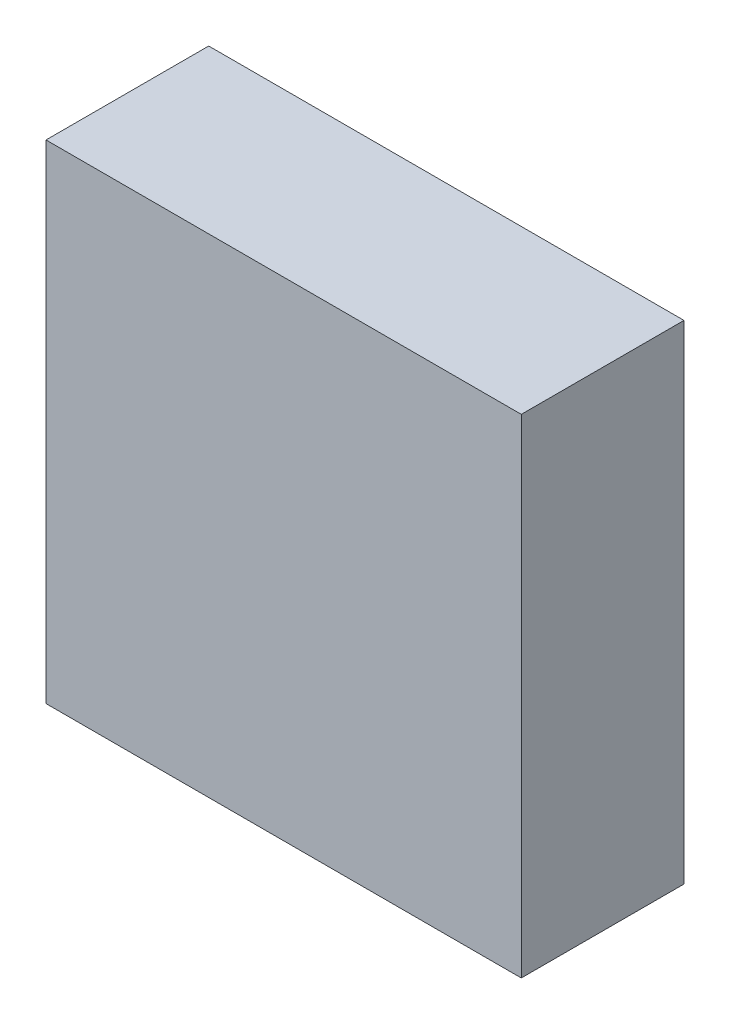
ISO-10303-21;
HEADER;
FILE_DESCRIPTION(('STEP AP214'),'2;1');
FILE_NAME('part.step','',(''),(''),'','','');
FILE_SCHEMA(('AUTOMOTIVE_DESIGN { 1 0 10303 214 1 1 1 1 }'));
ENDSEC;
DATA;
#1=APPLICATION_CONTEXT('core data for automotive mechanical design processes');
#2=APPLICATION_PROTOCOL_DEFINITION('international standard','automotive_design',2000,#1);
#3=PRODUCT_CONTEXT('',#1,'mechanical');
#4=PRODUCT('Part','Part','',(#3));
#5=PRODUCT_RELATED_PRODUCT_CATEGORY('part','',(#4));
#6=PRODUCT_DEFINITION_FORMATION('','',#4);
#7=PRODUCT_DEFINITION_CONTEXT('part definition',#1,'design');
#8=PRODUCT_DEFINITION('design','',#6,#7);
#9=PRODUCT_DEFINITION_SHAPE('','',#8);
#10=(LENGTH_UNIT() NAMED_UNIT(*) SI_UNIT(.MILLI.,.METRE.));
#11=(NAMED_UNIT(*) PLANE_ANGLE_UNIT() SI_UNIT($,.RADIAN.));
#12=(NAMED_UNIT(*) SI_UNIT($,.STERADIAN.) SOLID_ANGLE_UNIT());
#13=UNCERTAINTY_MEASURE_WITH_UNIT(LENGTH_MEASURE(1.E-05),#10,'distance_accuracy_value','');
#14=(GEOMETRIC_REPRESENTATION_CONTEXT(3) GLOBAL_UNCERTAINTY_ASSIGNED_CONTEXT((#13)) GLOBAL_UNIT_ASSIGNED_CONTEXT((#10,
#11,#12)) REPRESENTATION_CONTEXT('',''));
#15=CARTESIAN_POINT('',(0.,0.,0.));
#16=DIRECTION('',(0.,0.,1.));
#17=DIRECTION('',(1.,0.,0.));
#18=AXIS2_PLACEMENT_3D('',#15,#16,#17);
#19=CARTESIAN_POINT('',(-1.4224,-1.5,1.));
#20=DIRECTION('',(1.,0.,0.));
#21=DIRECTION('',(0.,0.,-1.));
#22=AXIS2_PLACEMENT_3D('',#19,#20,#21);
#23=PLANE('',#22);
#24=DIRECTION('',(0.,-1.,0.));
#25=VECTOR('',#24,1.);
#26=CARTESIAN_POINT('',(-1.4224,-1.5,0.));
#27=LINE('',#26,#25);
#28=CARTESIAN_POINT('',(-1.4224,1.5,0.));
#29=VERTEX_POINT('',#28);
#30=CARTESIAN_POINT('',(-1.4224,-1.5,0.));
#31=VERTEX_POINT('',#30);
#32=EDGE_CURVE('E95',#29,#31,#27,.T.);
#33=ORIENTED_EDGE('',*,*,#32,.T.);
#34=DIRECTION('',(0.,0.,-1.));
#35=VECTOR('',#34,1.);
#36=CARTESIAN_POINT('',(-1.4224,-1.5,1.));
#37=LINE('',#36,#35);
#38=CARTESIAN_POINT('',(-1.4224,-1.5,1.));
#39=VERTEX_POINT('',#38);
#40=EDGE_CURVE('E11',#39,#31,#37,.T.);
#41=ORIENTED_EDGE('',*,*,#40,.F.);
#42=DIRECTION('',(0.,-1.,0.));
#43=VECTOR('',#42,1.);
#44=CARTESIAN_POINT('',(-1.4224,-1.5,1.));
#45=LINE('',#44,#43);
#46=CARTESIAN_POINT('',(-1.4224,1.5,1.));
#47=VERTEX_POINT('',#46);
#48=EDGE_CURVE('E83',#47,#39,#45,.T.);
#49=ORIENTED_EDGE('',*,*,#48,.F.);
#50=DIRECTION('',(0.,0.,-1.));
#51=VECTOR('',#50,1.);
#52=CARTESIAN_POINT('',(-1.4224,1.5,1.));
#53=LINE('',#52,#51);
#54=EDGE_CURVE('E91',#47,#29,#53,.T.);
#55=ORIENTED_EDGE('',*,*,#54,.T.);
#56=EDGE_LOOP('',(#33,#41,#49,#55));
#57=FACE_BOUND('',#56,.T.);
#58=ADVANCED_FACE('F32',(#57),#23,.F.);
#59=CARTESIAN_POINT('',(1.4986,-1.5,1.));
#60=DIRECTION('',(0.,1.,0.));
#61=DIRECTION('',(0.,0.,1.));
#62=AXIS2_PLACEMENT_3D('',#59,#60,#61);
#63=PLANE('',#62);
#64=DIRECTION('',(1.,0.,0.));
#65=VECTOR('',#64,1.);
#66=CARTESIAN_POINT('',(1.4986,-1.5,0.));
#67=LINE('',#66,#65);
#68=CARTESIAN_POINT('',(1.4986,-1.5,0.));
#69=VERTEX_POINT('',#68);
#70=EDGE_CURVE('E87',#31,#69,#67,.T.);
#71=ORIENTED_EDGE('',*,*,#70,.T.);
#72=DIRECTION('',(0.,0.,-1.));
#73=VECTOR('',#72,1.);
#74=CARTESIAN_POINT('',(1.4986,-1.5,1.));
#75=LINE('',#74,#73);
#76=CARTESIAN_POINT('',(1.4986,-1.5,1.));
#77=VERTEX_POINT('',#76);
#78=EDGE_CURVE('E40',#77,#69,#75,.T.);
#79=ORIENTED_EDGE('',*,*,#78,.F.);
#80=DIRECTION('',(1.,0.,0.));
#81=VECTOR('',#80,1.);
#82=CARTESIAN_POINT('',(1.4986,-1.5,1.));
#83=LINE('',#82,#81);
#84=EDGE_CURVE('E78',#39,#77,#83,.T.);
#85=ORIENTED_EDGE('',*,*,#84,.F.);
#86=ORIENTED_EDGE('',*,*,#40,.T.);
#87=EDGE_LOOP('',(#71,#79,#85,#86));
#88=FACE_BOUND('',#87,.T.);
#89=ADVANCED_FACE('F86',(#88),#63,.F.);
#90=CARTESIAN_POINT('',(1.4986,1.5,1.));
#91=DIRECTION('',(-1.,0.,0.));
#92=DIRECTION('',(0.,0.,1.));
#93=AXIS2_PLACEMENT_3D('',#90,#91,#92);
#94=PLANE('',#93);
#95=DIRECTION('',(0.,1.,0.));
#96=VECTOR('',#95,1.);
#97=CARTESIAN_POINT('',(1.4986,1.5,0.));
#98=LINE('',#97,#96);
#99=CARTESIAN_POINT('',(1.4986,1.5,0.));
#100=VERTEX_POINT('',#99);
#101=EDGE_CURVE('E65',#69,#100,#98,.T.);
#102=ORIENTED_EDGE('',*,*,#101,.T.);
#103=DIRECTION('',(0.,0.,-1.));
#104=VECTOR('',#103,1.);
#105=CARTESIAN_POINT('',(1.4986,1.5,1.));
#106=LINE('',#105,#104);
#107=CARTESIAN_POINT('',(1.4986,1.5,1.));
#108=VERTEX_POINT('',#107);
#109=EDGE_CURVE('E88',#108,#100,#106,.T.);
#110=ORIENTED_EDGE('',*,*,#109,.F.);
#111=DIRECTION('',(0.,1.,0.));
#112=VECTOR('',#111,1.);
#113=CARTESIAN_POINT('',(1.4986,1.5,1.));
#114=LINE('',#113,#112);
#115=EDGE_CURVE('E81',#77,#108,#114,.T.);
#116=ORIENTED_EDGE('',*,*,#115,.F.);
#117=ORIENTED_EDGE('',*,*,#78,.T.);
#118=EDGE_LOOP('',(#102,#110,#116,#117));
#119=FACE_BOUND('',#118,.T.);
#120=ADVANCED_FACE('F89',(#119),#94,.F.);
#121=CARTESIAN_POINT('',(-1.4224,1.5,1.));
#122=DIRECTION('',(0.,-1.,0.));
#123=DIRECTION('',(0.,0.,-1.));
#124=AXIS2_PLACEMENT_3D('',#121,#122,#123);
#125=PLANE('',#124);
#126=DIRECTION('',(-1.,0.,0.));
#127=VECTOR('',#126,1.);
#128=CARTESIAN_POINT('',(-1.4224,1.5,0.));
#129=LINE('',#128,#127);
#130=EDGE_CURVE('E71',#100,#29,#129,.T.);
#131=ORIENTED_EDGE('',*,*,#130,.T.);
#132=ORIENTED_EDGE('',*,*,#54,.F.);
#133=DIRECTION('',(-1.,0.,0.));
#134=VECTOR('',#133,1.);
#135=CARTESIAN_POINT('',(-1.4224,1.5,1.));
#136=LINE('',#135,#134);
#137=EDGE_CURVE('E48',#108,#47,#136,.T.);
#138=ORIENTED_EDGE('',*,*,#137,.F.);
#139=ORIENTED_EDGE('',*,*,#109,.T.);
#140=EDGE_LOOP('',(#131,#132,#138,#139));
#141=FACE_BOUND('',#140,.T.);
#142=ADVANCED_FACE('F102',(#141),#125,.F.);
#143=CARTESIAN_POINT('',(0.,0.,1.));
#144=DIRECTION('',(0.,0.,-1.));
#145=DIRECTION('',(-1.,0.,0.));
#146=AXIS2_PLACEMENT_3D('',#143,#144,#145);
#147=PLANE('',#146);
#148=ORIENTED_EDGE('',*,*,#48,.T.);
#149=ORIENTED_EDGE('',*,*,#84,.T.);
#150=ORIENTED_EDGE('',*,*,#115,.T.);
#151=ORIENTED_EDGE('',*,*,#137,.T.);
#152=EDGE_LOOP('',(#148,#149,#150,#151));
#153=FACE_BOUND('',#152,.T.);
#154=ADVANCED_FACE('F79',(#153),#147,.F.);
#155=CARTESIAN_POINT('',(0.,0.,0.));
#156=DIRECTION('',(0.,0.,-1.));
#157=DIRECTION('',(-1.,0.,0.));
#158=AXIS2_PLACEMENT_3D('',#155,#156,#157);
#159=PLANE('',#158);
#160=ORIENTED_EDGE('',*,*,#32,.F.);
#161=ORIENTED_EDGE('',*,*,#130,.F.);
#162=ORIENTED_EDGE('',*,*,#101,.F.);
#163=ORIENTED_EDGE('',*,*,#70,.F.);
#164=EDGE_LOOP('',(#160,#161,#162,#163));
#165=FACE_BOUND('',#164,.T.);
#166=ADVANCED_FACE('F105',(#165),#159,.T.);
#167=CLOSED_SHELL('',(#58,#89,#120,#142,#154,#166));
#168=MANIFOLD_SOLID_BREP('B2',#167);
#169=ADVANCED_BREP_SHAPE_REPRESENTATION('',(#18,#168),#14);
#170=SHAPE_DEFINITION_REPRESENTATION(#9,#169);
ENDSEC;
END-ISO-10303-21;
